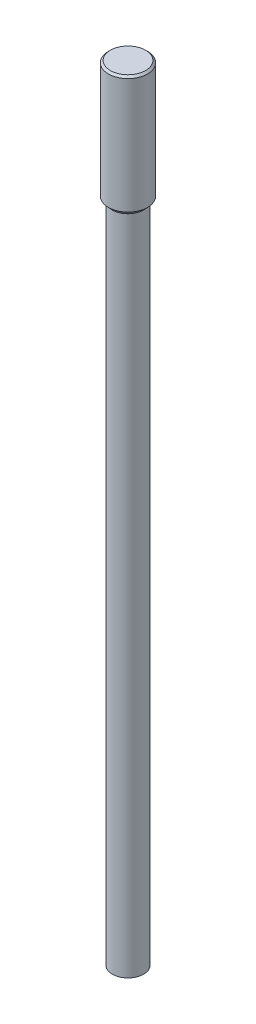
ISO-10303-21;
HEADER;
FILE_DESCRIPTION(('STEP AP214'),'2;1');
FILE_NAME('part.step','',(''),(''),'','','');
FILE_SCHEMA(('AUTOMOTIVE_DESIGN { 1 0 10303 214 1 1 1 1 }'));
ENDSEC;
DATA;
#1=APPLICATION_CONTEXT('core data for automotive mechanical design processes');
#2=APPLICATION_PROTOCOL_DEFINITION('international standard','automotive_design',2000,#1);
#3=PRODUCT_CONTEXT('',#1,'mechanical');
#4=PRODUCT('Part','Part','',(#3));
#5=PRODUCT_RELATED_PRODUCT_CATEGORY('part','',(#4));
#6=PRODUCT_DEFINITION_FORMATION('','',#4);
#7=PRODUCT_DEFINITION_CONTEXT('part definition',#1,'design');
#8=PRODUCT_DEFINITION('design','',#6,#7);
#9=PRODUCT_DEFINITION_SHAPE('','',#8);
#10=(LENGTH_UNIT() NAMED_UNIT(*) SI_UNIT(.MILLI.,.METRE.));
#11=(NAMED_UNIT(*) PLANE_ANGLE_UNIT() SI_UNIT($,.RADIAN.));
#12=(NAMED_UNIT(*) SI_UNIT($,.STERADIAN.) SOLID_ANGLE_UNIT());
#13=UNCERTAINTY_MEASURE_WITH_UNIT(LENGTH_MEASURE(1.E-05),#10,'distance_accuracy_value','');
#14=(GEOMETRIC_REPRESENTATION_CONTEXT(3) GLOBAL_UNCERTAINTY_ASSIGNED_CONTEXT((#13)) GLOBAL_UNIT_ASSIGNED_CONTEXT((#10,
#11,#12)) REPRESENTATION_CONTEXT('',''));
#15=CARTESIAN_POINT('',(0.,0.,0.));
#16=DIRECTION('',(0.,0.,1.));
#17=DIRECTION('',(1.,0.,0.));
#18=AXIS2_PLACEMENT_3D('',#15,#16,#17);
#19=CARTESIAN_POINT('',(0.,109.917798466594,0.));
#20=DIRECTION('',(0.,1.,0.));
#21=DIRECTION('',(-1.,0.,0.));
#22=AXIS2_PLACEMENT_3D('',#19,#20,#21);
#23=PLANE('',#22);
#24=CARTESIAN_POINT('',(0.,109.917798466594,0.));
#25=DIRECTION('',(0.,1.,0.));
#26=DIRECTION('',(-1.,0.,0.));
#27=AXIS2_PLACEMENT_3D('',#24,#25,#26);
#28=CIRCLE('',#27,4.49999999999992);
#29=CARTESIAN_POINT('',(-4.49999999999993,109.917798466594,0.));
#30=VERTEX_POINT('',#29);
#31=EDGE_CURVE('E38',#30,#30,#28,.T.);
#32=ORIENTED_EDGE('',*,*,#31,.T.);
#33=EDGE_LOOP('',(#32));
#34=FACE_BOUND('',#33,.T.);
#35=ADVANCED_FACE('F31',(#34),#23,.T.);
#36=CARTESIAN_POINT('',(0.,109.917798466594,0.));
#37=DIRECTION('',(0.,1.,0.));
#38=DIRECTION('',(-1.,0.,0.));
#39=AXIS2_PLACEMENT_3D('',#36,#37,#38);
#40=CYLINDRICAL_SURFACE('',#39,4.99999999999999);
#41=CARTESIAN_POINT('',(0.,109.417798466594,0.));
#42=DIRECTION('',(0.,1.,0.));
#43=DIRECTION('',(-1.,0.,0.));
#44=AXIS2_PLACEMENT_3D('',#41,#42,#43);
#45=CIRCLE('',#44,4.99999999999999);
#46=CARTESIAN_POINT('',(-5.,109.417798466594,0.));
#47=VERTEX_POINT('',#46);
#48=EDGE_CURVE('E10',#47,#47,#45,.F.);
#49=ORIENTED_EDGE('',*,*,#48,.T.);
#50=EDGE_LOOP('',(#49));
#51=FACE_BOUND('',#50,.T.);
#52=CARTESIAN_POINT('',(0.,79.9177984665936,0.));
#53=DIRECTION('',(0.,1.,0.));
#54=DIRECTION('',(-1.,0.,0.));
#55=AXIS2_PLACEMENT_3D('',#52,#53,#54);
#56=CIRCLE('',#55,4.99999999999999);
#57=CARTESIAN_POINT('',(-5.,79.9177984665936,0.));
#58=VERTEX_POINT('',#57);
#59=EDGE_CURVE('E42',#58,#58,#56,.T.);
#60=ORIENTED_EDGE('',*,*,#59,.T.);
#61=EDGE_LOOP('',(#60));
#62=FACE_BOUND('',#61,.T.);
#63=ADVANCED_FACE('F69',(#51,#62),#40,.T.);
#64=CARTESIAN_POINT('',(0.,79.9177984665936,0.));
#65=DIRECTION('',(0.,1.,0.));
#66=DIRECTION('',(-1.,0.,0.));
#67=AXIS2_PLACEMENT_3D('',#64,#65,#66);
#68=CONICAL_SURFACE('',#67,4.99999999999999,0.746477499094256);
#69=CARTESIAN_POINT('',(0.,78.8367622313609,0.));
#70=DIRECTION('',(0.,1.,0.));
#71=DIRECTION('',(-1.,0.,0.));
#72=AXIS2_PLACEMENT_3D('',#69,#70,#71);
#73=CIRCLE('',#72,3.99999999999999);
#74=CARTESIAN_POINT('',(-4.,78.8367622313609,0.));
#75=VERTEX_POINT('',#74);
#76=EDGE_CURVE('E46',#75,#75,#73,.T.);
#77=ORIENTED_EDGE('',*,*,#76,.T.);
#78=EDGE_LOOP('',(#77));
#79=FACE_BOUND('',#78,.T.);
#80=ORIENTED_EDGE('',*,*,#59,.F.);
#81=EDGE_LOOP('',(#80));
#82=FACE_BOUND('',#81,.T.);
#83=ADVANCED_FACE('F66',(#79,#82),#68,.T.);
#84=CARTESIAN_POINT('',(0.,109.917798466594,0.));
#85=DIRECTION('',(0.,1.,0.));
#86=DIRECTION('',(-1.,0.,0.));
#87=AXIS2_PLACEMENT_3D('',#84,#85,#86);
#88=CYLINDRICAL_SURFACE('',#87,4.);
#89=CARTESIAN_POINT('',(0.,-90.0822015334064,0.));
#90=DIRECTION('',(0.,1.,0.));
#91=DIRECTION('',(-1.,0.,0.));
#92=AXIS2_PLACEMENT_3D('',#89,#90,#91);
#93=CIRCLE('',#92,4.);
#94=CARTESIAN_POINT('',(-3.99999999999998,-90.0822015334064,0.));
#95=VERTEX_POINT('',#94);
#96=EDGE_CURVE('E51',#95,#95,#93,.T.);
#97=ORIENTED_EDGE('',*,*,#96,.T.);
#98=EDGE_LOOP('',(#97));
#99=FACE_BOUND('',#98,.T.);
#100=ORIENTED_EDGE('',*,*,#76,.F.);
#101=EDGE_LOOP('',(#100));
#102=FACE_BOUND('',#101,.T.);
#103=ADVANCED_FACE('F55',(#99,#102),#88,.T.);
#104=CARTESIAN_POINT('',(-3.99999999999998,-90.0822015334064,0.));
#105=DIRECTION('',(0.,-1.,0.));
#106=DIRECTION('',(1.,0.,0.));
#107=AXIS2_PLACEMENT_3D('',#104,#105,#106);
#108=PLANE('',#107);
#109=ORIENTED_EDGE('',*,*,#96,.F.);
#110=EDGE_LOOP('',(#109));
#111=FACE_BOUND('',#110,.T.);
#112=ADVANCED_FACE('F58',(#111),#108,.T.);
#113=CARTESIAN_POINT('',(0.,109.917798466594,0.));
#114=DIRECTION('',(0.,-1.,0.));
#115=DIRECTION('',(1.,0.,0.));
#116=AXIS2_PLACEMENT_3D('',#113,#114,#115);
#117=CONICAL_SURFACE('',#116,4.49999999999992,0.785398163397452);
#118=ORIENTED_EDGE('',*,*,#48,.F.);
#119=EDGE_LOOP('',(#118));
#120=FACE_BOUND('',#119,.T.);
#121=ORIENTED_EDGE('',*,*,#31,.F.);
#122=EDGE_LOOP('',(#121));
#123=FACE_BOUND('',#122,.T.);
#124=ADVANCED_FACE('F33',(#120,#123),#117,.T.);
#125=CLOSED_SHELL('',(#35,#63,#83,#103,#112,#124));
#126=MANIFOLD_SOLID_BREP('B2',#125);
#127=ADVANCED_BREP_SHAPE_REPRESENTATION('',(#18,#126),#14);
#128=SHAPE_DEFINITION_REPRESENTATION(#9,#127);
ENDSEC;
END-ISO-10303-21;
